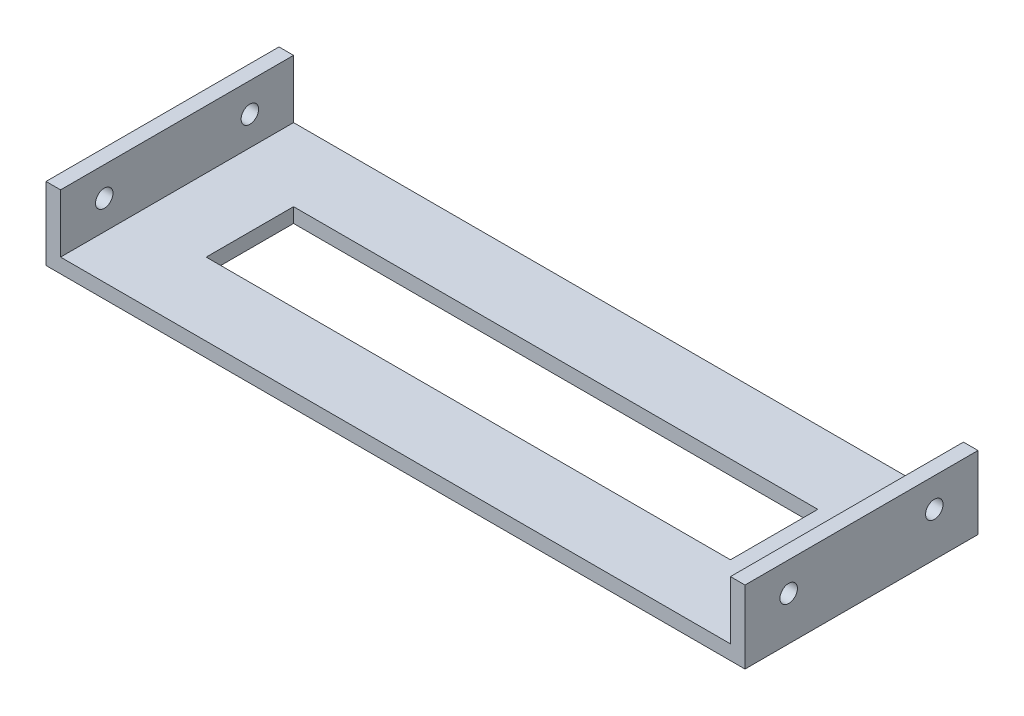
ISO-10303-21;
HEADER;
FILE_DESCRIPTION(('STEP AP214'),'2;1');
FILE_NAME('part.step','',(''),(''),'','','');
FILE_SCHEMA(('AUTOMOTIVE_DESIGN { 1 0 10303 214 1 1 1 1 }'));
ENDSEC;
DATA;
#1=APPLICATION_CONTEXT('core data for automotive mechanical design processes');
#2=APPLICATION_PROTOCOL_DEFINITION('international standard','automotive_design',2000,#1);
#3=PRODUCT_CONTEXT('',#1,'mechanical');
#4=PRODUCT('Part','Part','',(#3));
#5=PRODUCT_RELATED_PRODUCT_CATEGORY('part','',(#4));
#6=PRODUCT_DEFINITION_FORMATION('','',#4);
#7=PRODUCT_DEFINITION_CONTEXT('part definition',#1,'design');
#8=PRODUCT_DEFINITION('design','',#6,#7);
#9=PRODUCT_DEFINITION_SHAPE('','',#8);
#10=(LENGTH_UNIT() NAMED_UNIT(*) SI_UNIT(.MILLI.,.METRE.));
#11=(NAMED_UNIT(*) PLANE_ANGLE_UNIT() SI_UNIT($,.RADIAN.));
#12=(NAMED_UNIT(*) SI_UNIT($,.STERADIAN.) SOLID_ANGLE_UNIT());
#13=UNCERTAINTY_MEASURE_WITH_UNIT(LENGTH_MEASURE(1.E-05),#10,'distance_accuracy_value','');
#14=(GEOMETRIC_REPRESENTATION_CONTEXT(3) GLOBAL_UNCERTAINTY_ASSIGNED_CONTEXT((#13)) GLOBAL_UNIT_ASSIGNED_CONTEXT((#10,
#11,#12)) REPRESENTATION_CONTEXT('',''));
#15=CARTESIAN_POINT('',(0.,0.,0.));
#16=DIRECTION('',(0.,0.,1.));
#17=DIRECTION('',(1.,0.,0.));
#18=AXIS2_PLACEMENT_3D('',#15,#16,#17);
#19=CARTESIAN_POINT('',(120.,5.,40.));
#20=DIRECTION('',(-1.,0.,0.));
#21=DIRECTION('',(0.,0.,1.));
#22=AXIS2_PLACEMENT_3D('',#19,#20,#21);
#23=PLANE('',#22);
#24=DIRECTION('',(0.,0.,-1.));
#25=VECTOR('',#24,1.);
#26=CARTESIAN_POINT('',(120.,0.,40.));
#27=LINE('',#26,#25);
#28=CARTESIAN_POINT('',(120.,0.,40.));
#29=VERTEX_POINT('',#28);
#30=CARTESIAN_POINT('',(120.,0.,-40.));
#31=VERTEX_POINT('',#30);
#32=EDGE_CURVE('E243',#29,#31,#27,.T.);
#33=ORIENTED_EDGE('',*,*,#32,.T.);
#34=DIRECTION('',(0.,-1.,0.));
#35=VECTOR('',#34,1.);
#36=CARTESIAN_POINT('',(120.,5.,-40.));
#37=LINE('',#36,#35);
#38=CARTESIAN_POINT('',(120.,25.,-40.));
#39=VERTEX_POINT('',#38);
#40=EDGE_CURVE('E11',#39,#31,#37,.T.);
#41=ORIENTED_EDGE('',*,*,#40,.F.);
#42=DIRECTION('',(0.,0.,-1.));
#43=VECTOR('',#42,1.);
#44=CARTESIAN_POINT('',(120.,25.,-40.));
#45=LINE('',#44,#43);
#46=CARTESIAN_POINT('',(120.,25.,40.));
#47=VERTEX_POINT('',#46);
#48=EDGE_CURVE('E176',#47,#39,#45,.T.);
#49=ORIENTED_EDGE('',*,*,#48,.F.);
#50=DIRECTION('',(0.,-1.,0.));
#51=VECTOR('',#50,1.);
#52=CARTESIAN_POINT('',(120.,5.,40.));
#53=LINE('',#52,#51);
#54=EDGE_CURVE('E141',#47,#29,#53,.T.);
#55=ORIENTED_EDGE('',*,*,#54,.T.);
#56=EDGE_LOOP('',(#33,#41,#49,#55));
#57=FACE_BOUND('',#56,.T.);
#58=CARTESIAN_POINT('',(120.,15.,-25.));
#59=DIRECTION('',(-1.,0.,0.));
#60=DIRECTION('',(0.,0.,1.));
#61=AXIS2_PLACEMENT_3D('',#58,#59,#60);
#62=CIRCLE('',#61,3.);
#63=CARTESIAN_POINT('',(120.,15.,-22.));
#64=VERTEX_POINT('',#63);
#65=EDGE_CURVE('E281',#64,#64,#62,.T.);
#66=ORIENTED_EDGE('',*,*,#65,.T.);
#67=EDGE_LOOP('',(#66));
#68=FACE_BOUND('',#67,.T.);
#69=CARTESIAN_POINT('',(120.,15.,25.));
#70=DIRECTION('',(1.,0.,0.));
#71=DIRECTION('',(0.,0.,-1.));
#72=AXIS2_PLACEMENT_3D('',#69,#70,#71);
#73=CIRCLE('',#72,3.);
#74=CARTESIAN_POINT('',(120.,15.,22.));
#75=VERTEX_POINT('',#74);
#76=EDGE_CURVE('E275',#75,#75,#73,.T.);
#77=ORIENTED_EDGE('',*,*,#76,.F.);
#78=EDGE_LOOP('',(#77));
#79=FACE_BOUND('',#78,.T.);
#80=ADVANCED_FACE('F39',(#57,#68,#79),#23,.F.);
#81=CARTESIAN_POINT('',(-120.,5.,40.));
#82=DIRECTION('',(1.,0.,0.));
#83=DIRECTION('',(0.,0.,-1.));
#84=AXIS2_PLACEMENT_3D('',#81,#82,#83);
#85=PLANE('',#84);
#86=DIRECTION('',(0.,0.,1.));
#87=VECTOR('',#86,1.);
#88=CARTESIAN_POINT('',(-120.,0.,40.));
#89=LINE('',#88,#87);
#90=CARTESIAN_POINT('',(-120.,0.,-40.));
#91=VERTEX_POINT('',#90);
#92=CARTESIAN_POINT('',(-120.,0.,40.));
#93=VERTEX_POINT('',#92);
#94=EDGE_CURVE('E137',#91,#93,#89,.T.);
#95=ORIENTED_EDGE('',*,*,#94,.T.);
#96=DIRECTION('',(0.,-1.,0.));
#97=VECTOR('',#96,1.);
#98=CARTESIAN_POINT('',(-120.,5.,40.));
#99=LINE('',#98,#97);
#100=CARTESIAN_POINT('',(-120.,25.,40.));
#101=VERTEX_POINT('',#100);
#102=EDGE_CURVE('E129',#101,#93,#99,.T.);
#103=ORIENTED_EDGE('',*,*,#102,.F.);
#104=DIRECTION('',(0.,0.,1.));
#105=VECTOR('',#104,1.);
#106=CARTESIAN_POINT('',(-120.,25.,-40.));
#107=LINE('',#106,#105);
#108=CARTESIAN_POINT('',(-120.,25.,-40.));
#109=VERTEX_POINT('',#108);
#110=EDGE_CURVE('E135',#109,#101,#107,.T.);
#111=ORIENTED_EDGE('',*,*,#110,.F.);
#112=DIRECTION('',(0.,-1.,0.));
#113=VECTOR('',#112,1.);
#114=CARTESIAN_POINT('',(-120.,5.,-40.));
#115=LINE('',#114,#113);
#116=EDGE_CURVE('E48',#109,#91,#115,.T.);
#117=ORIENTED_EDGE('',*,*,#116,.T.);
#118=EDGE_LOOP('',(#95,#103,#111,#117));
#119=FACE_BOUND('',#118,.T.);
#120=CARTESIAN_POINT('',(-120.,15.,-25.));
#121=DIRECTION('',(-1.,0.,0.));
#122=DIRECTION('',(0.,0.,1.));
#123=AXIS2_PLACEMENT_3D('',#120,#121,#122);
#124=CIRCLE('',#123,3.);
#125=CARTESIAN_POINT('',(-120.,15.,-22.));
#126=VERTEX_POINT('',#125);
#127=EDGE_CURVE('E287',#126,#126,#124,.T.);
#128=ORIENTED_EDGE('',*,*,#127,.F.);
#129=EDGE_LOOP('',(#128));
#130=FACE_BOUND('',#129,.T.);
#131=CARTESIAN_POINT('',(-120.,15.,25.));
#132=DIRECTION('',(1.,0.,0.));
#133=DIRECTION('',(0.,0.,-1.));
#134=AXIS2_PLACEMENT_3D('',#131,#132,#133);
#135=CIRCLE('',#134,3.);
#136=CARTESIAN_POINT('',(-120.,15.,22.));
#137=VERTEX_POINT('',#136);
#138=EDGE_CURVE('E268',#137,#137,#135,.T.);
#139=ORIENTED_EDGE('',*,*,#138,.T.);
#140=EDGE_LOOP('',(#139));
#141=FACE_BOUND('',#140,.T.);
#142=ADVANCED_FACE('F131',(#119,#130,#141),#85,.F.);
#143=CARTESIAN_POINT('',(115.,25.,-40.));
#144=DIRECTION('',(1.,0.,0.));
#145=DIRECTION('',(0.,0.,-1.));
#146=AXIS2_PLACEMENT_3D('',#143,#144,#145);
#147=PLANE('',#146);
#148=DIRECTION('',(0.,0.,1.));
#149=VECTOR('',#148,1.);
#150=CARTESIAN_POINT('',(115.,5.,-40.));
#151=LINE('',#150,#149);
#152=CARTESIAN_POINT('',(115.,5.,-40.));
#153=VERTEX_POINT('',#152);
#154=CARTESIAN_POINT('',(115.,5.,40.));
#155=VERTEX_POINT('',#154);
#156=EDGE_CURVE('E61',#153,#155,#151,.T.);
#157=ORIENTED_EDGE('',*,*,#156,.T.);
#158=DIRECTION('',(0.,-1.,0.));
#159=VECTOR('',#158,1.);
#160=CARTESIAN_POINT('',(115.,25.,40.));
#161=LINE('',#160,#159);
#162=CARTESIAN_POINT('',(115.,25.,40.));
#163=VERTEX_POINT('',#162);
#164=EDGE_CURVE('E190',#163,#155,#161,.T.);
#165=ORIENTED_EDGE('',*,*,#164,.F.);
#166=DIRECTION('',(0.,0.,1.));
#167=VECTOR('',#166,1.);
#168=CARTESIAN_POINT('',(115.,25.,-40.));
#169=LINE('',#168,#167);
#170=CARTESIAN_POINT('',(115.,25.,-40.));
#171=VERTEX_POINT('',#170);
#172=EDGE_CURVE('E183',#171,#163,#169,.T.);
#173=ORIENTED_EDGE('',*,*,#172,.F.);
#174=DIRECTION('',(0.,-1.,0.));
#175=VECTOR('',#174,1.);
#176=CARTESIAN_POINT('',(115.,25.,-40.));
#177=LINE('',#176,#175);
#178=EDGE_CURVE('E196',#171,#153,#177,.T.);
#179=ORIENTED_EDGE('',*,*,#178,.T.);
#180=EDGE_LOOP('',(#157,#165,#173,#179));
#181=FACE_BOUND('',#180,.T.);
#182=CARTESIAN_POINT('',(115.,15.,-25.));
#183=DIRECTION('',(1.,0.,0.));
#184=DIRECTION('',(0.,0.,-1.));
#185=AXIS2_PLACEMENT_3D('',#182,#183,#184);
#186=CIRCLE('',#185,3.);
#187=CARTESIAN_POINT('',(115.,15.,-28.));
#188=VERTEX_POINT('',#187);
#189=EDGE_CURVE('E267',#188,#188,#186,.F.);
#190=ORIENTED_EDGE('',*,*,#189,.F.);
#191=EDGE_LOOP('',(#190));
#192=FACE_BOUND('',#191,.T.);
#193=CARTESIAN_POINT('',(115.,15.,25.));
#194=DIRECTION('',(1.,0.,0.));
#195=DIRECTION('',(0.,0.,-1.));
#196=AXIS2_PLACEMENT_3D('',#193,#194,#195);
#197=CIRCLE('',#196,3.);
#198=CARTESIAN_POINT('',(115.,15.,22.));
#199=VERTEX_POINT('',#198);
#200=EDGE_CURVE('E161',#199,#199,#197,.T.);
#201=ORIENTED_EDGE('',*,*,#200,.T.);
#202=EDGE_LOOP('',(#201));
#203=FACE_BOUND('',#202,.T.);
#204=ADVANCED_FACE('F294',(#181,#192,#203),#147,.F.);
#205=CARTESIAN_POINT('',(-115.,25.,-40.));
#206=DIRECTION('',(-1.,0.,0.));
#207=DIRECTION('',(0.,0.,1.));
#208=AXIS2_PLACEMENT_3D('',#205,#206,#207);
#209=PLANE('',#208);
#210=DIRECTION('',(0.,0.,-1.));
#211=VECTOR('',#210,1.);
#212=CARTESIAN_POINT('',(-115.,5.,-40.));
#213=LINE('',#212,#211);
#214=CARTESIAN_POINT('',(-115.,5.,40.));
#215=VERTEX_POINT('',#214);
#216=CARTESIAN_POINT('',(-115.,5.,-40.));
#217=VERTEX_POINT('',#216);
#218=EDGE_CURVE('E158',#215,#217,#213,.T.);
#219=ORIENTED_EDGE('',*,*,#218,.T.);
#220=DIRECTION('',(0.,-1.,0.));
#221=VECTOR('',#220,1.);
#222=CARTESIAN_POINT('',(-115.,25.,-40.));
#223=LINE('',#222,#221);
#224=CARTESIAN_POINT('',(-115.,25.,-40.));
#225=VERTEX_POINT('',#224);
#226=EDGE_CURVE('E169',#225,#217,#223,.T.);
#227=ORIENTED_EDGE('',*,*,#226,.F.);
#228=DIRECTION('',(0.,0.,-1.));
#229=VECTOR('',#228,1.);
#230=CARTESIAN_POINT('',(-115.,25.,-40.));
#231=LINE('',#230,#229);
#232=CARTESIAN_POINT('',(-115.,25.,40.));
#233=VERTEX_POINT('',#232);
#234=EDGE_CURVE('E151',#233,#225,#231,.T.);
#235=ORIENTED_EDGE('',*,*,#234,.F.);
#236=DIRECTION('',(0.,-1.,0.));
#237=VECTOR('',#236,1.);
#238=CARTESIAN_POINT('',(-115.,25.,40.));
#239=LINE('',#238,#237);
#240=EDGE_CURVE('E147',#233,#215,#239,.T.);
#241=ORIENTED_EDGE('',*,*,#240,.T.);
#242=EDGE_LOOP('',(#219,#227,#235,#241));
#243=FACE_BOUND('',#242,.T.);
#244=CARTESIAN_POINT('',(-115.,15.,-25.));
#245=DIRECTION('',(-1.,0.,0.));
#246=DIRECTION('',(0.,0.,1.));
#247=AXIS2_PLACEMENT_3D('',#244,#245,#246);
#248=CIRCLE('',#247,3.);
#249=CARTESIAN_POINT('',(-115.,15.,-22.));
#250=VERTEX_POINT('',#249);
#251=EDGE_CURVE('E264',#250,#250,#248,.F.);
#252=ORIENTED_EDGE('',*,*,#251,.F.);
#253=EDGE_LOOP('',(#252));
#254=FACE_BOUND('',#253,.T.);
#255=CARTESIAN_POINT('',(-115.,15.,25.));
#256=DIRECTION('',(-1.,0.,0.));
#257=DIRECTION('',(0.,0.,1.));
#258=AXIS2_PLACEMENT_3D('',#255,#256,#257);
#259=CIRCLE('',#258,3.);
#260=CARTESIAN_POINT('',(-115.,15.,28.));
#261=VERTEX_POINT('',#260);
#262=EDGE_CURVE('E42',#261,#261,#259,.T.);
#263=ORIENTED_EDGE('',*,*,#262,.T.);
#264=EDGE_LOOP('',(#263));
#265=FACE_BOUND('',#264,.T.);
#266=ADVANCED_FACE('F300',(#243,#254,#265),#209,.F.);
#267=CARTESIAN_POINT('',(0.,5.,0.));
#268=DIRECTION('',(0.,-1.,0.));
#269=DIRECTION('',(0.,0.,-1.));
#270=AXIS2_PLACEMENT_3D('',#267,#268,#269);
#271=PLANE('',#270);
#272=DIRECTION('',(0.,0.,-1.));
#273=VECTOR('',#272,1.);
#274=CARTESIAN_POINT('',(90.,5.,-15.));
#275=LINE('',#274,#273);
#276=CARTESIAN_POINT('',(90.,5.,15.));
#277=VERTEX_POINT('',#276);
#278=CARTESIAN_POINT('',(90.,5.,-15.));
#279=VERTEX_POINT('',#278);
#280=EDGE_CURVE('E201',#277,#279,#275,.T.);
#281=ORIENTED_EDGE('',*,*,#280,.F.);
#282=DIRECTION('',(1.,0.,0.));
#283=VECTOR('',#282,1.);
#284=CARTESIAN_POINT('',(-90.,5.,15.));
#285=LINE('',#284,#283);
#286=CARTESIAN_POINT('',(-90.,5.,15.));
#287=VERTEX_POINT('',#286);
#288=EDGE_CURVE('E212',#287,#277,#285,.T.);
#289=ORIENTED_EDGE('',*,*,#288,.F.);
#290=DIRECTION('',(0.,0.,1.));
#291=VECTOR('',#290,1.);
#292=CARTESIAN_POINT('',(-90.,5.,-15.));
#293=LINE('',#292,#291);
#294=CARTESIAN_POINT('',(-90.,5.,-15.));
#295=VERTEX_POINT('',#294);
#296=EDGE_CURVE('E208',#295,#287,#293,.T.);
#297=ORIENTED_EDGE('',*,*,#296,.F.);
#298=DIRECTION('',(-1.,0.,0.));
#299=VECTOR('',#298,1.);
#300=CARTESIAN_POINT('',(-90.,5.,-15.));
#301=LINE('',#300,#299);
#302=EDGE_CURVE('E204',#279,#295,#301,.T.);
#303=ORIENTED_EDGE('',*,*,#302,.F.);
#304=EDGE_LOOP('',(#281,#289,#297,#303));
#305=FACE_BOUND('',#304,.T.);
#306=ORIENTED_EDGE('',*,*,#218,.F.);
#307=DIRECTION('',(1.,0.,0.));
#308=VECTOR('',#307,1.);
#309=CARTESIAN_POINT('',(-120.,5.,40.));
#310=LINE('',#309,#308);
#311=EDGE_CURVE('E246',#215,#155,#310,.T.);
#312=ORIENTED_EDGE('',*,*,#311,.T.);
#313=ORIENTED_EDGE('',*,*,#156,.F.);
#314=DIRECTION('',(-1.,0.,0.));
#315=VECTOR('',#314,1.);
#316=CARTESIAN_POINT('',(-120.,5.,-40.));
#317=LINE('',#316,#315);
#318=EDGE_CURVE('E56',#153,#217,#317,.T.);
#319=ORIENTED_EDGE('',*,*,#318,.T.);
#320=EDGE_LOOP('',(#306,#312,#313,#319));
#321=FACE_BOUND('',#320,.T.);
#322=ADVANCED_FACE('F315',(#305,#321),#271,.F.);
#323=CARTESIAN_POINT('',(0.,0.,0.));
#324=DIRECTION('',(0.,-1.,0.));
#325=DIRECTION('',(0.,0.,-1.));
#326=AXIS2_PLACEMENT_3D('',#323,#324,#325);
#327=PLANE('',#326);
#328=ORIENTED_EDGE('',*,*,#32,.F.);
#329=DIRECTION('',(1.,0.,0.));
#330=VECTOR('',#329,1.);
#331=CARTESIAN_POINT('',(-120.,0.,40.));
#332=LINE('',#331,#330);
#333=EDGE_CURVE('E247',#93,#29,#332,.T.);
#334=ORIENTED_EDGE('',*,*,#333,.F.);
#335=ORIENTED_EDGE('',*,*,#94,.F.);
#336=DIRECTION('',(-1.,0.,0.));
#337=VECTOR('',#336,1.);
#338=CARTESIAN_POINT('',(-120.,0.,-40.));
#339=LINE('',#338,#337);
#340=EDGE_CURVE('E253',#31,#91,#339,.T.);
#341=ORIENTED_EDGE('',*,*,#340,.F.);
#342=EDGE_LOOP('',(#328,#334,#335,#341));
#343=FACE_BOUND('',#342,.T.);
#344=DIRECTION('',(1.,0.,0.));
#345=VECTOR('',#344,1.);
#346=CARTESIAN_POINT('',(-90.,0.,15.));
#347=LINE('',#346,#345);
#348=CARTESIAN_POINT('',(-90.,0.,15.));
#349=VERTEX_POINT('',#348);
#350=CARTESIAN_POINT('',(90.,0.,15.));
#351=VERTEX_POINT('',#350);
#352=EDGE_CURVE('E205',#349,#351,#347,.T.);
#353=ORIENTED_EDGE('',*,*,#352,.T.);
#354=DIRECTION('',(0.,0.,-1.));
#355=VECTOR('',#354,1.);
#356=CARTESIAN_POINT('',(90.,0.,-15.));
#357=LINE('',#356,#355);
#358=CARTESIAN_POINT('',(90.,0.,-15.));
#359=VERTEX_POINT('',#358);
#360=EDGE_CURVE('E200',#351,#359,#357,.T.);
#361=ORIENTED_EDGE('',*,*,#360,.T.);
#362=DIRECTION('',(-1.,0.,0.));
#363=VECTOR('',#362,1.);
#364=CARTESIAN_POINT('',(-90.,0.,-15.));
#365=LINE('',#364,#363);
#366=CARTESIAN_POINT('',(-90.,0.,-15.));
#367=VERTEX_POINT('',#366);
#368=EDGE_CURVE('E219',#359,#367,#365,.T.);
#369=ORIENTED_EDGE('',*,*,#368,.T.);
#370=DIRECTION('',(0.,0.,1.));
#371=VECTOR('',#370,1.);
#372=CARTESIAN_POINT('',(-90.,0.,-15.));
#373=LINE('',#372,#371);
#374=EDGE_CURVE('E223',#367,#349,#373,.T.);
#375=ORIENTED_EDGE('',*,*,#374,.T.);
#376=EDGE_LOOP('',(#353,#361,#369,#375));
#377=FACE_BOUND('',#376,.T.);
#378=ADVANCED_FACE('F308',(#343,#377),#327,.T.);
#379=CARTESIAN_POINT('',(-120.,5.,-40.));
#380=DIRECTION('',(0.,0.,1.));
#381=DIRECTION('',(1.,0.,0.));
#382=AXIS2_PLACEMENT_3D('',#379,#380,#381);
#383=PLANE('',#382);
#384=ORIENTED_EDGE('',*,*,#340,.T.);
#385=ORIENTED_EDGE('',*,*,#116,.F.);
#386=DIRECTION('',(-1.,0.,0.));
#387=VECTOR('',#386,1.);
#388=CARTESIAN_POINT('',(-120.,25.,-40.));
#389=LINE('',#388,#387);
#390=EDGE_CURVE('E156',#225,#109,#389,.T.);
#391=ORIENTED_EDGE('',*,*,#390,.F.);
#392=ORIENTED_EDGE('',*,*,#226,.T.);
#393=ORIENTED_EDGE('',*,*,#318,.F.);
#394=ORIENTED_EDGE('',*,*,#178,.F.);
#395=DIRECTION('',(-1.,0.,0.));
#396=VECTOR('',#395,1.);
#397=CARTESIAN_POINT('',(120.,25.,-40.));
#398=LINE('',#397,#396);
#399=EDGE_CURVE('E180',#39,#171,#398,.T.);
#400=ORIENTED_EDGE('',*,*,#399,.F.);
#401=ORIENTED_EDGE('',*,*,#40,.T.);
#402=EDGE_LOOP('',(#384,#385,#391,#392,#393,#394,#400,#401));
#403=FACE_BOUND('',#402,.T.);
#404=ADVANCED_FACE('F306',(#403),#383,.F.);
#405=CARTESIAN_POINT('',(-120.,5.,40.));
#406=DIRECTION('',(0.,0.,-1.));
#407=DIRECTION('',(-1.,0.,0.));
#408=AXIS2_PLACEMENT_3D('',#405,#406,#407);
#409=PLANE('',#408);
#410=ORIENTED_EDGE('',*,*,#333,.T.);
#411=ORIENTED_EDGE('',*,*,#54,.F.);
#412=DIRECTION('',(1.,0.,0.));
#413=VECTOR('',#412,1.);
#414=CARTESIAN_POINT('',(120.,25.,40.));
#415=LINE('',#414,#413);
#416=EDGE_CURVE('E186',#163,#47,#415,.T.);
#417=ORIENTED_EDGE('',*,*,#416,.F.);
#418=ORIENTED_EDGE('',*,*,#164,.T.);
#419=ORIENTED_EDGE('',*,*,#311,.F.);
#420=ORIENTED_EDGE('',*,*,#240,.F.);
#421=DIRECTION('',(1.,0.,0.));
#422=VECTOR('',#421,1.);
#423=CARTESIAN_POINT('',(-120.,25.,40.));
#424=LINE('',#423,#422);
#425=EDGE_CURVE('E144',#101,#233,#424,.T.);
#426=ORIENTED_EDGE('',*,*,#425,.F.);
#427=ORIENTED_EDGE('',*,*,#102,.T.);
#428=EDGE_LOOP('',(#410,#411,#417,#418,#419,#420,#426,#427));
#429=FACE_BOUND('',#428,.T.);
#430=ADVANCED_FACE('F145',(#429),#409,.F.);
#431=CARTESIAN_POINT('',(90.,5.,-15.));
#432=DIRECTION('',(-1.,0.,0.));
#433=DIRECTION('',(0.,0.,1.));
#434=AXIS2_PLACEMENT_3D('',#431,#432,#433);
#435=PLANE('',#434);
#436=ORIENTED_EDGE('',*,*,#360,.F.);
#437=DIRECTION('',(0.,-1.,0.));
#438=VECTOR('',#437,1.);
#439=CARTESIAN_POINT('',(90.,5.,15.));
#440=LINE('',#439,#438);
#441=EDGE_CURVE('E215',#277,#351,#440,.T.);
#442=ORIENTED_EDGE('',*,*,#441,.F.);
#443=ORIENTED_EDGE('',*,*,#280,.T.);
#444=DIRECTION('',(0.,-1.,0.));
#445=VECTOR('',#444,1.);
#446=CARTESIAN_POINT('',(90.,5.,-15.));
#447=LINE('',#446,#445);
#448=EDGE_CURVE('E239',#279,#359,#447,.T.);
#449=ORIENTED_EDGE('',*,*,#448,.T.);
#450=EDGE_LOOP('',(#436,#442,#443,#449));
#451=FACE_BOUND('',#450,.T.);
#452=ADVANCED_FACE('F314',(#451),#435,.T.);
#453=CARTESIAN_POINT('',(-90.,5.,-15.));
#454=DIRECTION('',(0.,0.,1.));
#455=DIRECTION('',(1.,0.,0.));
#456=AXIS2_PLACEMENT_3D('',#453,#454,#455);
#457=PLANE('',#456);
#458=ORIENTED_EDGE('',*,*,#368,.F.);
#459=ORIENTED_EDGE('',*,*,#448,.F.);
#460=ORIENTED_EDGE('',*,*,#302,.T.);
#461=DIRECTION('',(0.,-1.,0.));
#462=VECTOR('',#461,1.);
#463=CARTESIAN_POINT('',(-90.,5.,-15.));
#464=LINE('',#463,#462);
#465=EDGE_CURVE('E236',#295,#367,#464,.T.);
#466=ORIENTED_EDGE('',*,*,#465,.T.);
#467=EDGE_LOOP('',(#458,#459,#460,#466));
#468=FACE_BOUND('',#467,.T.);
#469=ADVANCED_FACE('F343',(#468),#457,.T.);
#470=CARTESIAN_POINT('',(-90.,5.,-15.));
#471=DIRECTION('',(1.,0.,0.));
#472=DIRECTION('',(0.,0.,-1.));
#473=AXIS2_PLACEMENT_3D('',#470,#471,#472);
#474=PLANE('',#473);
#475=ORIENTED_EDGE('',*,*,#374,.F.);
#476=ORIENTED_EDGE('',*,*,#465,.F.);
#477=ORIENTED_EDGE('',*,*,#296,.T.);
#478=DIRECTION('',(0.,-1.,0.));
#479=VECTOR('',#478,1.);
#480=CARTESIAN_POINT('',(-90.,5.,15.));
#481=LINE('',#480,#479);
#482=EDGE_CURVE('E233',#287,#349,#481,.T.);
#483=ORIENTED_EDGE('',*,*,#482,.T.);
#484=EDGE_LOOP('',(#475,#476,#477,#483));
#485=FACE_BOUND('',#484,.T.);
#486=ADVANCED_FACE('F347',(#485),#474,.T.);
#487=CARTESIAN_POINT('',(-90.,5.,15.));
#488=DIRECTION('',(0.,0.,-1.));
#489=DIRECTION('',(-1.,0.,0.));
#490=AXIS2_PLACEMENT_3D('',#487,#488,#489);
#491=PLANE('',#490);
#492=ORIENTED_EDGE('',*,*,#352,.F.);
#493=ORIENTED_EDGE('',*,*,#482,.F.);
#494=ORIENTED_EDGE('',*,*,#288,.T.);
#495=ORIENTED_EDGE('',*,*,#441,.T.);
#496=EDGE_LOOP('',(#492,#493,#494,#495));
#497=FACE_BOUND('',#496,.T.);
#498=ADVANCED_FACE('F351',(#497),#491,.T.);
#499=CARTESIAN_POINT('',(0.,25.,0.));
#500=DIRECTION('',(0.,-1.,0.));
#501=DIRECTION('',(0.,0.,-1.));
#502=AXIS2_PLACEMENT_3D('',#499,#500,#501);
#503=PLANE('',#502);
#504=ORIENTED_EDGE('',*,*,#48,.T.);
#505=ORIENTED_EDGE('',*,*,#399,.T.);
#506=ORIENTED_EDGE('',*,*,#172,.T.);
#507=ORIENTED_EDGE('',*,*,#416,.T.);
#508=EDGE_LOOP('',(#504,#505,#506,#507));
#509=FACE_BOUND('',#508,.T.);
#510=ADVANCED_FACE('F324',(#509),#503,.F.);
#511=CARTESIAN_POINT('',(0.,25.,0.));
#512=DIRECTION('',(0.,1.,0.));
#513=DIRECTION('',(0.,0.,1.));
#514=AXIS2_PLACEMENT_3D('',#511,#512,#513);
#515=PLANE('',#514);
#516=ORIENTED_EDGE('',*,*,#110,.T.);
#517=ORIENTED_EDGE('',*,*,#425,.T.);
#518=ORIENTED_EDGE('',*,*,#234,.T.);
#519=ORIENTED_EDGE('',*,*,#390,.T.);
#520=EDGE_LOOP('',(#516,#517,#518,#519));
#521=FACE_BOUND('',#520,.T.);
#522=ADVANCED_FACE('F154',(#521),#515,.T.);
#523=CARTESIAN_POINT('',(-120.,15.,-25.));
#524=DIRECTION('',(1.,0.,0.));
#525=DIRECTION('',(0.,0.,-1.));
#526=AXIS2_PLACEMENT_3D('',#523,#524,#525);
#527=CYLINDRICAL_SURFACE('',#526,3.);
#528=ORIENTED_EDGE('',*,*,#127,.T.);
#529=EDGE_LOOP('',(#528));
#530=FACE_BOUND('',#529,.T.);
#531=ORIENTED_EDGE('',*,*,#251,.T.);
#532=EDGE_LOOP('',(#531));
#533=FACE_BOUND('',#532,.T.);
#534=ADVANCED_FACE('F292',(#530,#533),#527,.F.);
#535=CARTESIAN_POINT('',(-120.,15.,25.));
#536=DIRECTION('',(1.,0.,0.));
#537=DIRECTION('',(0.,0.,-1.));
#538=AXIS2_PLACEMENT_3D('',#535,#536,#537);
#539=CYLINDRICAL_SURFACE('',#538,3.);
#540=ORIENTED_EDGE('',*,*,#138,.F.);
#541=EDGE_LOOP('',(#540));
#542=FACE_BOUND('',#541,.T.);
#543=ORIENTED_EDGE('',*,*,#262,.F.);
#544=EDGE_LOOP('',(#543));
#545=FACE_BOUND('',#544,.T.);
#546=ADVANCED_FACE('F364',(#542,#545),#539,.F.);
#547=ORIENTED_EDGE('',*,*,#65,.F.);
#548=EDGE_LOOP('',(#547));
#549=FACE_BOUND('',#548,.T.);
#550=ORIENTED_EDGE('',*,*,#189,.T.);
#551=EDGE_LOOP('',(#550));
#552=FACE_BOUND('',#551,.T.);
#553=ADVANCED_FACE('F360',(#549,#552),#527,.F.);
#554=ORIENTED_EDGE('',*,*,#76,.T.);
#555=EDGE_LOOP('',(#554));
#556=FACE_BOUND('',#555,.T.);
#557=ORIENTED_EDGE('',*,*,#200,.F.);
#558=EDGE_LOOP('',(#557));
#559=FACE_BOUND('',#558,.T.);
#560=ADVANCED_FACE('F363',(#556,#559),#539,.F.);
#561=CLOSED_SHELL('',(#80,#142,#204,#266,#322,#378,#404,#430,#452,#469,#486,#498,#510,#522,#534,
#546,#553,#560));
#562=MANIFOLD_SOLID_BREP('B2',#561);
#563=ADVANCED_BREP_SHAPE_REPRESENTATION('',(#18,#562),#14);
#564=SHAPE_DEFINITION_REPRESENTATION(#9,#563);
ENDSEC;
END-ISO-10303-21;
